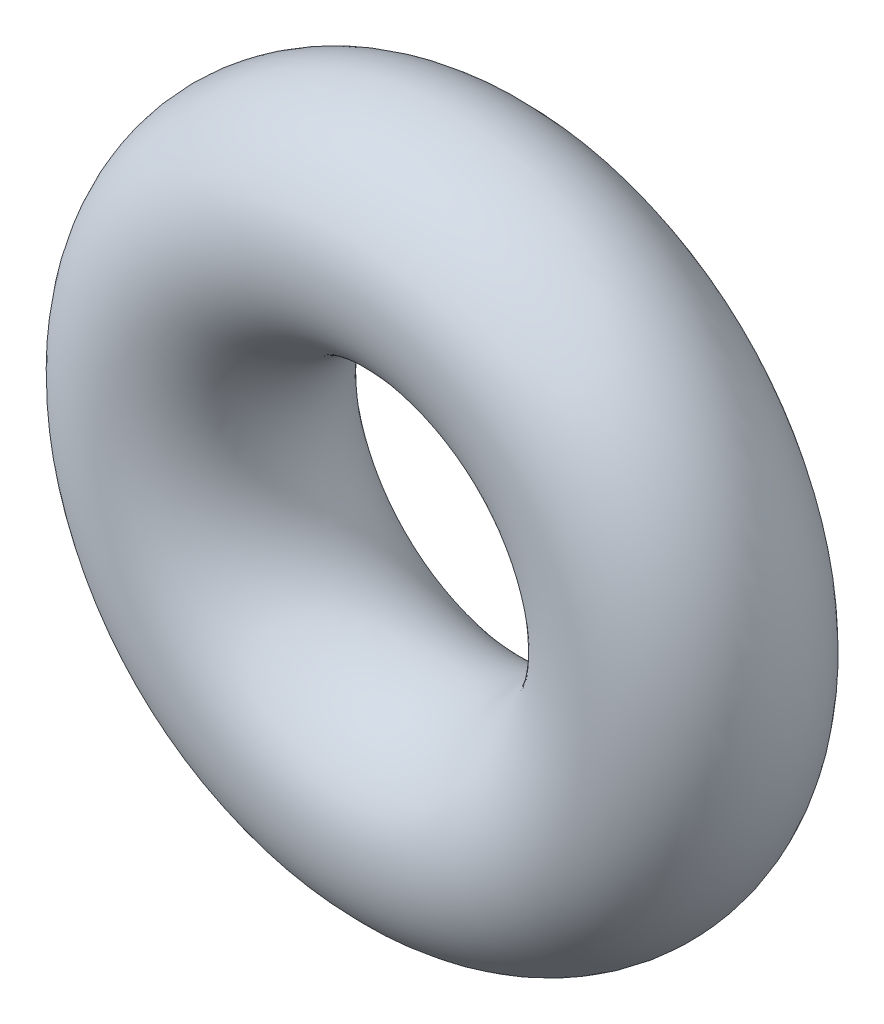
ISO-10303-21;
HEADER;
FILE_DESCRIPTION(('STEP AP214'),'2;1');
FILE_NAME('part.step','',(''),(''),'','','');
FILE_SCHEMA(('AUTOMOTIVE_DESIGN { 1 0 10303 214 1 1 1 1 }'));
ENDSEC;
DATA;
#1=APPLICATION_CONTEXT('core data for automotive mechanical design processes');
#2=APPLICATION_PROTOCOL_DEFINITION('international standard','automotive_design',2000,#1);
#3=PRODUCT_CONTEXT('',#1,'mechanical');
#4=PRODUCT('Part','Part','',(#3));
#5=PRODUCT_RELATED_PRODUCT_CATEGORY('part','',(#4));
#6=PRODUCT_DEFINITION_FORMATION('','',#4);
#7=PRODUCT_DEFINITION_CONTEXT('part definition',#1,'design');
#8=PRODUCT_DEFINITION('design','',#6,#7);
#9=PRODUCT_DEFINITION_SHAPE('','',#8);
#10=(LENGTH_UNIT() NAMED_UNIT(*) SI_UNIT(.MILLI.,.METRE.));
#11=(NAMED_UNIT(*) PLANE_ANGLE_UNIT() SI_UNIT($,.RADIAN.));
#12=(NAMED_UNIT(*) SI_UNIT($,.STERADIAN.) SOLID_ANGLE_UNIT());
#13=UNCERTAINTY_MEASURE_WITH_UNIT(LENGTH_MEASURE(1.E-05),#10,'distance_accuracy_value','');
#14=(GEOMETRIC_REPRESENTATION_CONTEXT(3) GLOBAL_UNCERTAINTY_ASSIGNED_CONTEXT((#13)) GLOBAL_UNIT_ASSIGNED_CONTEXT((#10,
#11,#12)) REPRESENTATION_CONTEXT('',''));
#15=CARTESIAN_POINT('',(0.,0.,0.));
#16=DIRECTION('',(0.,0.,1.));
#17=DIRECTION('',(1.,0.,0.));
#18=AXIS2_PLACEMENT_3D('',#15,#16,#17);
#19=CARTESIAN_POINT('',(0.,0.,0.));
#20=DIRECTION('',(0.,0.,1.));
#21=DIRECTION('',(1.,0.,0.));
#22=AXIS2_PLACEMENT_3D('',#19,#20,#21);
#23=TOROIDAL_SURFACE('',#22,148.75,67.5);
#24=CARTESIAN_POINT('',(-148.75,0.,0.));
#25=DIRECTION('',(0.,1.,0.));
#26=DIRECTION('',(0.,0.,1.));
#27=AXIS2_PLACEMENT_3D('',#24,#25,#26);
#28=CIRCLE('',#27,67.5);
#29=CARTESIAN_POINT('',(-216.25,0.,0.));
#30=VERTEX_POINT('',#29);
#31=EDGE_CURVE('E11',#30,#30,#28,.T.);
#32=CARTESIAN_POINT('',(0.,0.,0.));
#33=DIRECTION('',(0.,0.,1.));
#34=DIRECTION('',(1.,0.,0.));
#35=AXIS2_PLACEMENT_3D('',#32,#33,#34);
#36=CIRCLE('',#35,216.25);
#37=EDGE_CURVE('',#30,#30,#36,.T.);
#38=ORIENTED_EDGE('',*,*,#31,.F.);
#39=ORIENTED_EDGE('',*,*,#31,.T.);
#40=ORIENTED_EDGE('',*,*,#37,.T.);
#41=ORIENTED_EDGE('',*,*,#37,.F.);
#42=EDGE_LOOP('',(#38,#40,#39,#41));
#43=FACE_BOUND('',#42,.T.);
#44=ADVANCED_FACE('F39',(#43),#23,.T.);
#45=CLOSED_SHELL('',(#44));
#46=MANIFOLD_SOLID_BREP('B2',#45);
#47=ADVANCED_BREP_SHAPE_REPRESENTATION('',(#18,#46),#14);
#48=SHAPE_DEFINITION_REPRESENTATION(#9,#47);
ENDSEC;
END-ISO-10303-21;
